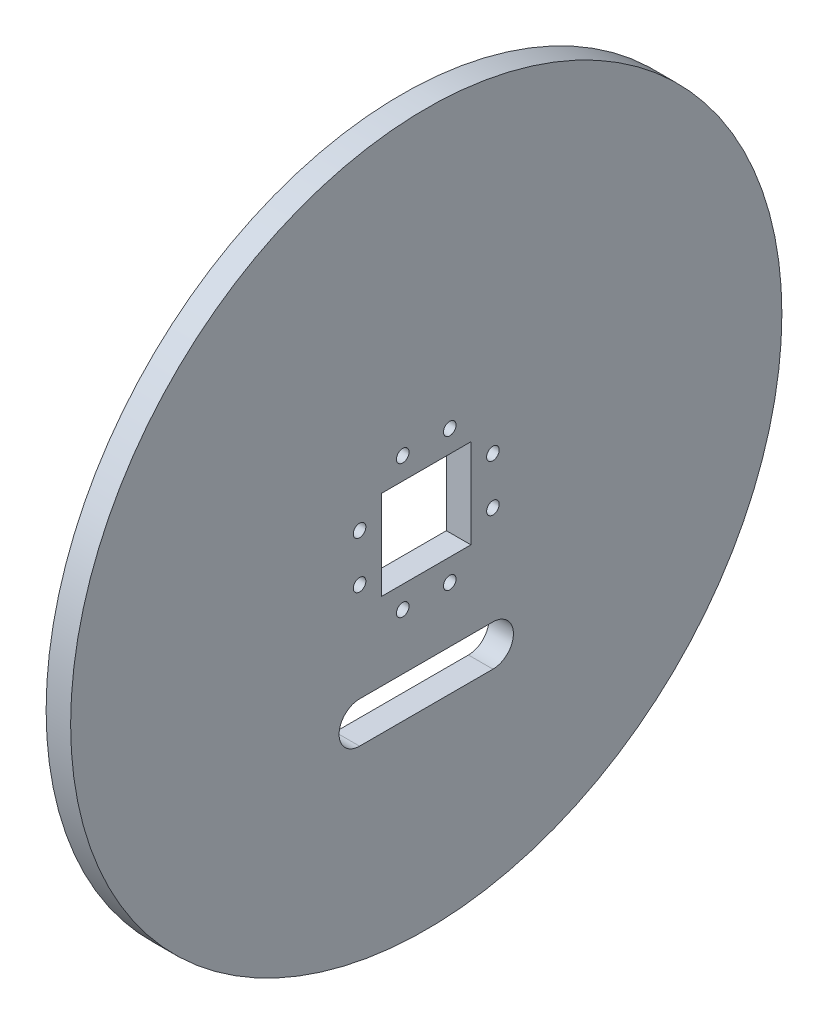
ISO-10303-21;
HEADER;
FILE_DESCRIPTION(('STEP AP214'),'2;1');
FILE_NAME('part.step','',(''),(''),'','','');
FILE_SCHEMA(('AUTOMOTIVE_DESIGN { 1 0 10303 214 1 1 1 1 }'));
ENDSEC;
DATA;
#1=APPLICATION_CONTEXT('core data for automotive mechanical design processes');
#2=APPLICATION_PROTOCOL_DEFINITION('international standard','automotive_design',2000,#1);
#3=PRODUCT_CONTEXT('',#1,'mechanical');
#4=PRODUCT('Part','Part','',(#3));
#5=PRODUCT_RELATED_PRODUCT_CATEGORY('part','',(#4));
#6=PRODUCT_DEFINITION_FORMATION('','',#4);
#7=PRODUCT_DEFINITION_CONTEXT('part definition',#1,'design');
#8=PRODUCT_DEFINITION('design','',#6,#7);
#9=PRODUCT_DEFINITION_SHAPE('','',#8);
#10=(LENGTH_UNIT() NAMED_UNIT(*) SI_UNIT(.MILLI.,.METRE.));
#11=(NAMED_UNIT(*) PLANE_ANGLE_UNIT() SI_UNIT($,.RADIAN.));
#12=(NAMED_UNIT(*) SI_UNIT($,.STERADIAN.) SOLID_ANGLE_UNIT());
#13=UNCERTAINTY_MEASURE_WITH_UNIT(LENGTH_MEASURE(1.E-05),#10,'distance_accuracy_value','');
#14=(GEOMETRIC_REPRESENTATION_CONTEXT(3) GLOBAL_UNCERTAINTY_ASSIGNED_CONTEXT((#13)) GLOBAL_UNIT_ASSIGNED_CONTEXT((#10,
#11,#12)) REPRESENTATION_CONTEXT('',''));
#15=CARTESIAN_POINT('',(0.,0.,0.));
#16=DIRECTION('',(0.,0.,1.));
#17=DIRECTION('',(1.,0.,0.));
#18=AXIS2_PLACEMENT_3D('',#15,#16,#17);
#19=CARTESIAN_POINT('',(7.,0.,0.));
#20=DIRECTION('',(1.,0.,0.));
#21=DIRECTION('',(0.,0.,-1.));
#22=AXIS2_PLACEMENT_3D('',#19,#20,#21);
#23=PLANE('',#22);
#24=CARTESIAN_POINT('',(7.,19.0500000000001,6.71844476050666));
#25=DIRECTION('',(1.,0.,0.));
#26=DIRECTION('',(0.,0.,-1.));
#27=AXIS2_PLACEMENT_3D('',#24,#25,#26);
#28=CIRCLE('',#27,1.8);
#29=CARTESIAN_POINT('',(7.,19.0500000000001,4.91844476050666));
#30=VERTEX_POINT('',#29);
#31=EDGE_CURVE('E232',#30,#30,#28,.T.);
#32=ORIENTED_EDGE('',*,*,#31,.F.);
#33=EDGE_LOOP('',(#32));
#34=FACE_BOUND('',#33,.T.);
#35=CARTESIAN_POINT('',(7.,-6.71844476050673,19.05));
#36=DIRECTION('',(1.,0.,0.));
#37=DIRECTION('',(0.,0.,-1.));
#38=AXIS2_PLACEMENT_3D('',#35,#36,#37);
#39=CIRCLE('',#38,1.8);
#40=CARTESIAN_POINT('',(7.,-6.71844476050673,17.25));
#41=VERTEX_POINT('',#40);
#42=EDGE_CURVE('E240',#41,#41,#39,.T.);
#43=ORIENTED_EDGE('',*,*,#42,.F.);
#44=EDGE_LOOP('',(#43));
#45=FACE_BOUND('',#44,.T.);
#46=CARTESIAN_POINT('',(7.,-19.05,-6.71844476050679));
#47=DIRECTION('',(1.,0.,0.));
#48=DIRECTION('',(0.,0.,-1.));
#49=AXIS2_PLACEMENT_3D('',#46,#47,#48);
#50=CIRCLE('',#49,1.8);
#51=CARTESIAN_POINT('',(7.,-19.05,-8.51844476050679));
#52=VERTEX_POINT('',#51);
#53=EDGE_CURVE('E248',#52,#52,#50,.T.);
#54=ORIENTED_EDGE('',*,*,#53,.F.);
#55=EDGE_LOOP('',(#54));
#56=FACE_BOUND('',#55,.T.);
#57=CARTESIAN_POINT('',(7.,6.71844476050686,-19.05));
#58=DIRECTION('',(1.,0.,0.));
#59=DIRECTION('',(0.,0.,-1.));
#60=AXIS2_PLACEMENT_3D('',#57,#58,#59);
#61=CIRCLE('',#60,1.8);
#62=CARTESIAN_POINT('',(7.,6.71844476050686,-20.85));
#63=VERTEX_POINT('',#62);
#64=EDGE_CURVE('E145',#63,#63,#61,.T.);
#65=ORIENTED_EDGE('',*,*,#64,.F.);
#66=EDGE_LOOP('',(#65));
#67=FACE_BOUND('',#66,.T.);
#68=CARTESIAN_POINT('',(7.,0.,0.));
#69=DIRECTION('',(1.,0.,0.));
#70=DIRECTION('',(0.,0.,-1.));
#71=AXIS2_PLACEMENT_3D('',#68,#69,#70);
#72=CIRCLE('',#71,101.6);
#73=CARTESIAN_POINT('',(7.,0.,-101.6));
#74=VERTEX_POINT('',#73);
#75=EDGE_CURVE('E11',#74,#74,#72,.T.);
#76=ORIENTED_EDGE('',*,*,#75,.T.);
#77=EDGE_LOOP('',(#76));
#78=FACE_BOUND('',#77,.T.);
#79=DIRECTION('',(0.,0.,1.));
#80=VECTOR('',#79,1.);
#81=CARTESIAN_POINT('',(7.,12.75,12.75));
#82=LINE('',#81,#80);
#83=CARTESIAN_POINT('',(7.,12.75,-12.75));
#84=VERTEX_POINT('',#83);
#85=CARTESIAN_POINT('',(7.,12.75,12.75));
#86=VERTEX_POINT('',#85);
#87=EDGE_CURVE('E157',#84,#86,#82,.T.);
#88=ORIENTED_EDGE('',*,*,#87,.F.);
#89=DIRECTION('',(0.,1.,0.));
#90=VECTOR('',#89,1.);
#91=CARTESIAN_POINT('',(7.,-12.75,-12.75));
#92=LINE('',#91,#90);
#93=CARTESIAN_POINT('',(7.,-12.75,-12.75));
#94=VERTEX_POINT('',#93);
#95=EDGE_CURVE('E155',#94,#84,#92,.T.);
#96=ORIENTED_EDGE('',*,*,#95,.F.);
#97=DIRECTION('',(0.,0.,-1.));
#98=VECTOR('',#97,1.);
#99=CARTESIAN_POINT('',(7.,-12.75,12.75));
#100=LINE('',#99,#98);
#101=CARTESIAN_POINT('',(7.,-12.75,12.75));
#102=VERTEX_POINT('',#101);
#103=EDGE_CURVE('E163',#102,#94,#100,.T.);
#104=ORIENTED_EDGE('',*,*,#103,.F.);
#105=DIRECTION('',(0.,-1.,0.));
#106=VECTOR('',#105,1.);
#107=CARTESIAN_POINT('',(7.,-12.75,12.75));
#108=LINE('',#107,#106);
#109=EDGE_CURVE('E160',#86,#102,#108,.T.);
#110=ORIENTED_EDGE('',*,*,#109,.F.);
#111=EDGE_LOOP('',(#88,#96,#104,#110));
#112=FACE_BOUND('',#111,.T.);
#113=DIRECTION('',(0.,0.,-1.));
#114=VECTOR('',#113,1.);
#115=CARTESIAN_POINT('',(7.,-46.6533897491123,19.05));
#116=LINE('',#115,#114);
#117=CARTESIAN_POINT('',(7.,-46.6533897491123,19.05));
#118=VERTEX_POINT('',#117);
#119=CARTESIAN_POINT('',(7.,-46.6533897491123,-19.05));
#120=VERTEX_POINT('',#119);
#121=EDGE_CURVE('E124',#118,#120,#116,.T.);
#122=ORIENTED_EDGE('',*,*,#121,.F.);
#123=CARTESIAN_POINT('',(7.,-40.8076638046452,19.05));
#124=DIRECTION('',(1.,0.,0.));
#125=DIRECTION('',(0.,0.,-1.));
#126=AXIS2_PLACEMENT_3D('',#123,#124,#125);
#127=CIRCLE('',#126,5.84572594446708);
#128=CARTESIAN_POINT('',(7.,-34.9619378601781,19.05));
#129=VERTEX_POINT('',#128);
#130=EDGE_CURVE('E116',#129,#118,#127,.T.);
#131=ORIENTED_EDGE('',*,*,#130,.F.);
#132=DIRECTION('',(0.,0.,1.));
#133=VECTOR('',#132,1.);
#134=CARTESIAN_POINT('',(7.,-34.9619378601781,19.05));
#135=LINE('',#134,#133);
#136=CARTESIAN_POINT('',(7.,-34.9619378601781,-19.05));
#137=VERTEX_POINT('',#136);
#138=EDGE_CURVE('E139',#137,#129,#135,.T.);
#139=ORIENTED_EDGE('',*,*,#138,.F.);
#140=CARTESIAN_POINT('',(7.,-40.8076638046452,-19.05));
#141=DIRECTION('',(1.,0.,0.));
#142=DIRECTION('',(0.,0.,-1.));
#143=AXIS2_PLACEMENT_3D('',#140,#141,#142);
#144=CIRCLE('',#143,5.84572594446708);
#145=EDGE_CURVE('E137',#120,#137,#144,.T.);
#146=ORIENTED_EDGE('',*,*,#145,.F.);
#147=EDGE_LOOP('',(#122,#131,#139,#146));
#148=FACE_BOUND('',#147,.T.);
#149=CARTESIAN_POINT('',(7.,-6.71844476050761,-19.05));
#150=DIRECTION('',(1.,0.,0.));
#151=DIRECTION('',(0.,0.,-1.));
#152=AXIS2_PLACEMENT_3D('',#149,#150,#151);
#153=CIRCLE('',#152,1.8);
#154=CARTESIAN_POINT('',(7.,-6.71844476050761,-20.85));
#155=VERTEX_POINT('',#154);
#156=EDGE_CURVE('E252',#155,#155,#153,.T.);
#157=ORIENTED_EDGE('',*,*,#156,.F.);
#158=EDGE_LOOP('',(#157));
#159=FACE_BOUND('',#158,.T.);
#160=CARTESIAN_POINT('',(7.,-19.05,6.71844476050768));
#161=DIRECTION('',(1.,0.,0.));
#162=DIRECTION('',(0.,0.,-1.));
#163=AXIS2_PLACEMENT_3D('',#160,#161,#162);
#164=CIRCLE('',#163,1.8);
#165=CARTESIAN_POINT('',(7.,-19.05,4.91844476050767));
#166=VERTEX_POINT('',#165);
#167=EDGE_CURVE('E244',#166,#166,#164,.T.);
#168=ORIENTED_EDGE('',*,*,#167,.F.);
#169=EDGE_LOOP('',(#168));
#170=FACE_BOUND('',#169,.T.);
#171=CARTESIAN_POINT('',(7.,6.71844476050774,19.0499999999999));
#172=DIRECTION('',(1.,0.,0.));
#173=DIRECTION('',(0.,0.,-1.));
#174=AXIS2_PLACEMENT_3D('',#171,#172,#173);
#175=CIRCLE('',#174,1.8);
#176=CARTESIAN_POINT('',(7.,6.71844476050774,17.2499999999999));
#177=VERTEX_POINT('',#176);
#178=EDGE_CURVE('E236',#177,#177,#175,.T.);
#179=ORIENTED_EDGE('',*,*,#178,.F.);
#180=EDGE_LOOP('',(#179));
#181=FACE_BOUND('',#180,.T.);
#182=CARTESIAN_POINT('',(7.,19.0499999999999,-6.71844476050781));
#183=DIRECTION('',(1.,0.,0.));
#184=DIRECTION('',(0.,0.,-1.));
#185=AXIS2_PLACEMENT_3D('',#182,#183,#184);
#186=CIRCLE('',#185,1.8);
#187=CARTESIAN_POINT('',(7.,19.0499999999999,-8.51844476050781));
#188=VERTEX_POINT('',#187);
#189=EDGE_CURVE('E227',#188,#188,#186,.T.);
#190=ORIENTED_EDGE('',*,*,#189,.F.);
#191=EDGE_LOOP('',(#190));
#192=FACE_BOUND('',#191,.T.);
#193=ADVANCED_FACE('F50',(#34,#45,#56,#67,#78,#112,#148,#159,#170,#181,#192),#23,.T.);
#194=CARTESIAN_POINT('',(0.,0.,0.));
#195=DIRECTION('',(1.,0.,0.));
#196=DIRECTION('',(0.,0.,-1.));
#197=AXIS2_PLACEMENT_3D('',#194,#195,#196);
#198=PLANE('',#197);
#199=DIRECTION('',(0.,1.,0.));
#200=VECTOR('',#199,1.);
#201=CARTESIAN_POINT('',(0.,-12.75,-12.75));
#202=LINE('',#201,#200);
#203=CARTESIAN_POINT('',(0.,-12.75,-12.75));
#204=VERTEX_POINT('',#203);
#205=CARTESIAN_POINT('',(0.,12.75,-12.75));
#206=VERTEX_POINT('',#205);
#207=EDGE_CURVE('E132',#204,#206,#202,.T.);
#208=ORIENTED_EDGE('',*,*,#207,.T.);
#209=DIRECTION('',(0.,0.,1.));
#210=VECTOR('',#209,1.);
#211=CARTESIAN_POINT('',(0.,12.75,12.75));
#212=LINE('',#211,#210);
#213=CARTESIAN_POINT('',(0.,12.75,12.75));
#214=VERTEX_POINT('',#213);
#215=EDGE_CURVE('E168',#206,#214,#212,.T.);
#216=ORIENTED_EDGE('',*,*,#215,.T.);
#217=DIRECTION('',(0.,-1.,0.));
#218=VECTOR('',#217,1.);
#219=CARTESIAN_POINT('',(0.,-12.75,12.75));
#220=LINE('',#219,#218);
#221=CARTESIAN_POINT('',(0.,-12.75,12.75));
#222=VERTEX_POINT('',#221);
#223=EDGE_CURVE('E171',#214,#222,#220,.T.);
#224=ORIENTED_EDGE('',*,*,#223,.T.);
#225=DIRECTION('',(0.,0.,-1.));
#226=VECTOR('',#225,1.);
#227=CARTESIAN_POINT('',(0.,-12.75,12.75));
#228=LINE('',#227,#226);
#229=EDGE_CURVE('E158',#222,#204,#228,.T.);
#230=ORIENTED_EDGE('',*,*,#229,.T.);
#231=EDGE_LOOP('',(#208,#216,#224,#230));
#232=FACE_BOUND('',#231,.T.);
#233=CARTESIAN_POINT('',(0.,0.,0.));
#234=DIRECTION('',(1.,0.,0.));
#235=DIRECTION('',(0.,0.,-1.));
#236=AXIS2_PLACEMENT_3D('',#233,#234,#235);
#237=CIRCLE('',#236,101.6);
#238=CARTESIAN_POINT('',(0.,0.,-101.6));
#239=VERTEX_POINT('',#238);
#240=EDGE_CURVE('E54',#239,#239,#237,.T.);
#241=ORIENTED_EDGE('',*,*,#240,.F.);
#242=EDGE_LOOP('',(#241));
#243=FACE_BOUND('',#242,.T.);
#244=CARTESIAN_POINT('',(0.,-40.8076638046452,19.05));
#245=DIRECTION('',(1.,0.,0.));
#246=DIRECTION('',(0.,0.,-1.));
#247=AXIS2_PLACEMENT_3D('',#244,#245,#246);
#248=CIRCLE('',#247,5.84572594446708);
#249=CARTESIAN_POINT('',(0.,-34.9619378601781,19.05));
#250=VERTEX_POINT('',#249);
#251=CARTESIAN_POINT('',(0.,-46.6533897491123,19.05));
#252=VERTEX_POINT('',#251);
#253=EDGE_CURVE('E74',#250,#252,#248,.T.);
#254=ORIENTED_EDGE('',*,*,#253,.T.);
#255=DIRECTION('',(0.,0.,-1.));
#256=VECTOR('',#255,1.);
#257=CARTESIAN_POINT('',(0.,-46.6533897491123,19.05));
#258=LINE('',#257,#256);
#259=CARTESIAN_POINT('',(0.,-46.6533897491123,-19.05));
#260=VERTEX_POINT('',#259);
#261=EDGE_CURVE('E131',#252,#260,#258,.T.);
#262=ORIENTED_EDGE('',*,*,#261,.T.);
#263=CARTESIAN_POINT('',(0.,-40.8076638046452,-19.05));
#264=DIRECTION('',(1.,0.,0.));
#265=DIRECTION('',(0.,0.,-1.));
#266=AXIS2_PLACEMENT_3D('',#263,#264,#265);
#267=CIRCLE('',#266,5.84572594446708);
#268=CARTESIAN_POINT('',(0.,-34.9619378601781,-19.05));
#269=VERTEX_POINT('',#268);
#270=EDGE_CURVE('E147',#260,#269,#267,.T.);
#271=ORIENTED_EDGE('',*,*,#270,.T.);
#272=DIRECTION('',(0.,0.,1.));
#273=VECTOR('',#272,1.);
#274=CARTESIAN_POINT('',(0.,-34.9619378601781,19.05));
#275=LINE('',#274,#273);
#276=EDGE_CURVE('E125',#269,#250,#275,.T.);
#277=ORIENTED_EDGE('',*,*,#276,.T.);
#278=EDGE_LOOP('',(#254,#262,#271,#277));
#279=FACE_BOUND('',#278,.T.);
#280=CARTESIAN_POINT('',(0.,6.71844476050686,-19.05));
#281=DIRECTION('',(1.,0.,0.));
#282=DIRECTION('',(0.,0.,-1.));
#283=AXIS2_PLACEMENT_3D('',#280,#281,#282);
#284=CIRCLE('',#283,1.8);
#285=CARTESIAN_POINT('',(0.,6.71844476050686,-20.85));
#286=VERTEX_POINT('',#285);
#287=EDGE_CURVE('E198',#286,#286,#284,.T.);
#288=ORIENTED_EDGE('',*,*,#287,.T.);
#289=EDGE_LOOP('',(#288));
#290=FACE_BOUND('',#289,.T.);
#291=CARTESIAN_POINT('',(0.,-6.71844476050761,-19.05));
#292=DIRECTION('',(1.,0.,0.));
#293=DIRECTION('',(0.,0.,-1.));
#294=AXIS2_PLACEMENT_3D('',#291,#292,#293);
#295=CIRCLE('',#294,1.8);
#296=CARTESIAN_POINT('',(0.,-6.71844476050761,-20.85));
#297=VERTEX_POINT('',#296);
#298=EDGE_CURVE('E202',#297,#297,#295,.T.);
#299=ORIENTED_EDGE('',*,*,#298,.T.);
#300=EDGE_LOOP('',(#299));
#301=FACE_BOUND('',#300,.T.);
#302=CARTESIAN_POINT('',(0.,-19.05,-6.71844476050679));
#303=DIRECTION('',(1.,0.,0.));
#304=DIRECTION('',(0.,0.,-1.));
#305=AXIS2_PLACEMENT_3D('',#302,#303,#304);
#306=CIRCLE('',#305,1.8);
#307=CARTESIAN_POINT('',(0.,-19.05,-8.51844476050679));
#308=VERTEX_POINT('',#307);
#309=EDGE_CURVE('E206',#308,#308,#306,.T.);
#310=ORIENTED_EDGE('',*,*,#309,.T.);
#311=EDGE_LOOP('',(#310));
#312=FACE_BOUND('',#311,.T.);
#313=CARTESIAN_POINT('',(0.,-19.05,6.71844476050768));
#314=DIRECTION('',(1.,0.,0.));
#315=DIRECTION('',(0.,0.,-1.));
#316=AXIS2_PLACEMENT_3D('',#313,#314,#315);
#317=CIRCLE('',#316,1.8);
#318=CARTESIAN_POINT('',(0.,-19.05,4.91844476050767));
#319=VERTEX_POINT('',#318);
#320=EDGE_CURVE('E210',#319,#319,#317,.T.);
#321=ORIENTED_EDGE('',*,*,#320,.T.);
#322=EDGE_LOOP('',(#321));
#323=FACE_BOUND('',#322,.T.);
#324=CARTESIAN_POINT('',(0.,-6.71844476050673,19.05));
#325=DIRECTION('',(1.,0.,0.));
#326=DIRECTION('',(0.,0.,-1.));
#327=AXIS2_PLACEMENT_3D('',#324,#325,#326);
#328=CIRCLE('',#327,1.8);
#329=CARTESIAN_POINT('',(0.,-6.71844476050673,17.25));
#330=VERTEX_POINT('',#329);
#331=EDGE_CURVE('E214',#330,#330,#328,.T.);
#332=ORIENTED_EDGE('',*,*,#331,.T.);
#333=EDGE_LOOP('',(#332));
#334=FACE_BOUND('',#333,.T.);
#335=CARTESIAN_POINT('',(0.,6.71844476050774,19.0499999999999));
#336=DIRECTION('',(1.,0.,0.));
#337=DIRECTION('',(0.,0.,-1.));
#338=AXIS2_PLACEMENT_3D('',#335,#336,#337);
#339=CIRCLE('',#338,1.8);
#340=CARTESIAN_POINT('',(0.,6.71844476050774,17.2499999999999));
#341=VERTEX_POINT('',#340);
#342=EDGE_CURVE('E218',#341,#341,#339,.T.);
#343=ORIENTED_EDGE('',*,*,#342,.T.);
#344=EDGE_LOOP('',(#343));
#345=FACE_BOUND('',#344,.T.);
#346=CARTESIAN_POINT('',(0.,19.0500000000001,6.71844476050666));
#347=DIRECTION('',(1.,0.,0.));
#348=DIRECTION('',(0.,0.,-1.));
#349=AXIS2_PLACEMENT_3D('',#346,#347,#348);
#350=CIRCLE('',#349,1.8);
#351=CARTESIAN_POINT('',(0.,19.0500000000001,4.91844476050666));
#352=VERTEX_POINT('',#351);
#353=EDGE_CURVE('E222',#352,#352,#350,.T.);
#354=ORIENTED_EDGE('',*,*,#353,.T.);
#355=EDGE_LOOP('',(#354));
#356=FACE_BOUND('',#355,.T.);
#357=CARTESIAN_POINT('',(0.,19.0499999999999,-6.71844476050781));
#358=DIRECTION('',(1.,0.,0.));
#359=DIRECTION('',(0.,0.,-1.));
#360=AXIS2_PLACEMENT_3D('',#357,#358,#359);
#361=CIRCLE('',#360,1.8);
#362=CARTESIAN_POINT('',(0.,19.0499999999999,-8.51844476050781));
#363=VERTEX_POINT('',#362);
#364=EDGE_CURVE('E225',#363,#363,#361,.T.);
#365=ORIENTED_EDGE('',*,*,#364,.T.);
#366=EDGE_LOOP('',(#365));
#367=FACE_BOUND('',#366,.T.);
#368=ADVANCED_FACE('F190',(#232,#243,#279,#290,#301,#312,#323,#334,#345,#356,#367),#198,.F.);
#369=CARTESIAN_POINT('',(7.,0.,0.));
#370=DIRECTION('',(-1.,0.,0.));
#371=DIRECTION('',(0.,0.,1.));
#372=AXIS2_PLACEMENT_3D('',#369,#370,#371);
#373=CYLINDRICAL_SURFACE('',#372,101.6);
#374=ORIENTED_EDGE('',*,*,#75,.F.);
#375=EDGE_LOOP('',(#374));
#376=FACE_BOUND('',#375,.T.);
#377=ORIENTED_EDGE('',*,*,#240,.T.);
#378=EDGE_LOOP('',(#377));
#379=FACE_BOUND('',#378,.T.);
#380=ADVANCED_FACE('F52',(#376,#379),#373,.T.);
#381=CARTESIAN_POINT('',(7.,-12.75,-12.75));
#382=DIRECTION('',(0.,0.,1.));
#383=DIRECTION('',(1.,0.,0.));
#384=AXIS2_PLACEMENT_3D('',#381,#382,#383);
#385=PLANE('',#384);
#386=ORIENTED_EDGE('',*,*,#207,.F.);
#387=DIRECTION('',(-1.,0.,0.));
#388=VECTOR('',#387,1.);
#389=CARTESIAN_POINT('',(7.,-12.75,-12.75));
#390=LINE('',#389,#388);
#391=EDGE_CURVE('E165',#94,#204,#390,.T.);
#392=ORIENTED_EDGE('',*,*,#391,.F.);
#393=ORIENTED_EDGE('',*,*,#95,.T.);
#394=DIRECTION('',(-1.,0.,0.));
#395=VECTOR('',#394,1.);
#396=CARTESIAN_POINT('',(7.,12.75,-12.75));
#397=LINE('',#396,#395);
#398=EDGE_CURVE('E182',#84,#206,#397,.T.);
#399=ORIENTED_EDGE('',*,*,#398,.T.);
#400=EDGE_LOOP('',(#386,#392,#393,#399));
#401=FACE_BOUND('',#400,.T.);
#402=ADVANCED_FACE('F280',(#401),#385,.T.);
#403=CARTESIAN_POINT('',(7.,12.75,12.75));
#404=DIRECTION('',(0.,-1.,0.));
#405=DIRECTION('',(0.,0.,-1.));
#406=AXIS2_PLACEMENT_3D('',#403,#404,#405);
#407=PLANE('',#406);
#408=ORIENTED_EDGE('',*,*,#215,.F.);
#409=ORIENTED_EDGE('',*,*,#398,.F.);
#410=ORIENTED_EDGE('',*,*,#87,.T.);
#411=DIRECTION('',(-1.,0.,0.));
#412=VECTOR('',#411,1.);
#413=CARTESIAN_POINT('',(7.,12.75,12.75));
#414=LINE('',#413,#412);
#415=EDGE_CURVE('E180',#86,#214,#414,.T.);
#416=ORIENTED_EDGE('',*,*,#415,.T.);
#417=EDGE_LOOP('',(#408,#409,#410,#416));
#418=FACE_BOUND('',#417,.T.);
#419=ADVANCED_FACE('F274',(#418),#407,.T.);
#420=CARTESIAN_POINT('',(7.,-12.75,12.75));
#421=DIRECTION('',(0.,0.,-1.));
#422=DIRECTION('',(-1.,0.,0.));
#423=AXIS2_PLACEMENT_3D('',#420,#421,#422);
#424=PLANE('',#423);
#425=ORIENTED_EDGE('',*,*,#223,.F.);
#426=ORIENTED_EDGE('',*,*,#415,.F.);
#427=ORIENTED_EDGE('',*,*,#109,.T.);
#428=DIRECTION('',(-1.,0.,0.));
#429=VECTOR('',#428,1.);
#430=CARTESIAN_POINT('',(7.,-12.75,12.75));
#431=LINE('',#430,#429);
#432=EDGE_CURVE('E178',#102,#222,#431,.T.);
#433=ORIENTED_EDGE('',*,*,#432,.T.);
#434=EDGE_LOOP('',(#425,#426,#427,#433));
#435=FACE_BOUND('',#434,.T.);
#436=ADVANCED_FACE('F277',(#435),#424,.T.);
#437=CARTESIAN_POINT('',(7.,-12.75,12.75));
#438=DIRECTION('',(0.,1.,0.));
#439=DIRECTION('',(0.,0.,1.));
#440=AXIS2_PLACEMENT_3D('',#437,#438,#439);
#441=PLANE('',#440);
#442=ORIENTED_EDGE('',*,*,#229,.F.);
#443=ORIENTED_EDGE('',*,*,#432,.F.);
#444=ORIENTED_EDGE('',*,*,#103,.T.);
#445=ORIENTED_EDGE('',*,*,#391,.T.);
#446=EDGE_LOOP('',(#442,#443,#444,#445));
#447=FACE_BOUND('',#446,.T.);
#448=ADVANCED_FACE('F282',(#447),#441,.T.);
#449=CARTESIAN_POINT('',(7.,-40.8076638046452,19.05));
#450=DIRECTION('',(-1.,0.,0.));
#451=DIRECTION('',(0.,0.,1.));
#452=AXIS2_PLACEMENT_3D('',#449,#450,#451);
#453=CYLINDRICAL_SURFACE('',#452,5.84572594446708);
#454=ORIENTED_EDGE('',*,*,#253,.F.);
#455=DIRECTION('',(-1.,0.,0.));
#456=VECTOR('',#455,1.);
#457=CARTESIAN_POINT('',(7.,-34.9619378601781,19.05));
#458=LINE('',#457,#456);
#459=EDGE_CURVE('E120',#129,#250,#458,.T.);
#460=ORIENTED_EDGE('',*,*,#459,.F.);
#461=ORIENTED_EDGE('',*,*,#130,.T.);
#462=DIRECTION('',(-1.,0.,0.));
#463=VECTOR('',#462,1.);
#464=CARTESIAN_POINT('',(7.,-46.6533897491123,19.05));
#465=LINE('',#464,#463);
#466=EDGE_CURVE('E119',#118,#252,#465,.T.);
#467=ORIENTED_EDGE('',*,*,#466,.T.);
#468=EDGE_LOOP('',(#454,#460,#461,#467));
#469=FACE_BOUND('',#468,.T.);
#470=ADVANCED_FACE('F118',(#469),#453,.F.);
#471=CARTESIAN_POINT('',(7.,-46.6533897491123,19.05));
#472=DIRECTION('',(0.,1.,0.));
#473=DIRECTION('',(0.,0.,1.));
#474=AXIS2_PLACEMENT_3D('',#471,#472,#473);
#475=PLANE('',#474);
#476=ORIENTED_EDGE('',*,*,#261,.F.);
#477=ORIENTED_EDGE('',*,*,#466,.F.);
#478=ORIENTED_EDGE('',*,*,#121,.T.);
#479=DIRECTION('',(-1.,0.,0.));
#480=VECTOR('',#479,1.);
#481=CARTESIAN_POINT('',(7.,-46.6533897491123,-19.05));
#482=LINE('',#481,#480);
#483=EDGE_CURVE('E133',#120,#260,#482,.T.);
#484=ORIENTED_EDGE('',*,*,#483,.T.);
#485=EDGE_LOOP('',(#476,#477,#478,#484));
#486=FACE_BOUND('',#485,.T.);
#487=ADVANCED_FACE('F128',(#486),#475,.T.);
#488=CARTESIAN_POINT('',(7.,-40.8076638046452,-19.05));
#489=DIRECTION('',(-1.,0.,0.));
#490=DIRECTION('',(0.,0.,1.));
#491=AXIS2_PLACEMENT_3D('',#488,#489,#490);
#492=CYLINDRICAL_SURFACE('',#491,5.84572594446708);
#493=ORIENTED_EDGE('',*,*,#270,.F.);
#494=ORIENTED_EDGE('',*,*,#483,.F.);
#495=ORIENTED_EDGE('',*,*,#145,.T.);
#496=DIRECTION('',(-1.,0.,0.));
#497=VECTOR('',#496,1.);
#498=CARTESIAN_POINT('',(7.,-34.9619378601781,-19.05));
#499=LINE('',#498,#497);
#500=EDGE_CURVE('E66',#137,#269,#499,.T.);
#501=ORIENTED_EDGE('',*,*,#500,.T.);
#502=EDGE_LOOP('',(#493,#494,#495,#501));
#503=FACE_BOUND('',#502,.T.);
#504=ADVANCED_FACE('F360',(#503),#492,.F.);
#505=CARTESIAN_POINT('',(7.,-34.9619378601781,19.05));
#506=DIRECTION('',(0.,-1.,0.));
#507=DIRECTION('',(0.,0.,-1.));
#508=AXIS2_PLACEMENT_3D('',#505,#506,#507);
#509=PLANE('',#508);
#510=ORIENTED_EDGE('',*,*,#276,.F.);
#511=ORIENTED_EDGE('',*,*,#500,.F.);
#512=ORIENTED_EDGE('',*,*,#138,.T.);
#513=ORIENTED_EDGE('',*,*,#459,.T.);
#514=EDGE_LOOP('',(#510,#511,#512,#513));
#515=FACE_BOUND('',#514,.T.);
#516=ADVANCED_FACE('F369',(#515),#509,.T.);
#517=CARTESIAN_POINT('',(7.,6.71844476050686,-19.05));
#518=DIRECTION('',(-1.,0.,0.));
#519=DIRECTION('',(0.,0.,1.));
#520=AXIS2_PLACEMENT_3D('',#517,#518,#519);
#521=CYLINDRICAL_SURFACE('',#520,1.8);
#522=ORIENTED_EDGE('',*,*,#64,.T.);
#523=EDGE_LOOP('',(#522));
#524=FACE_BOUND('',#523,.T.);
#525=ORIENTED_EDGE('',*,*,#287,.F.);
#526=EDGE_LOOP('',(#525));
#527=FACE_BOUND('',#526,.T.);
#528=ADVANCED_FACE('F259',(#524,#527),#521,.F.);
#529=CARTESIAN_POINT('',(7.,-6.71844476050761,-19.05));
#530=DIRECTION('',(-1.,0.,0.));
#531=DIRECTION('',(0.,0.,1.));
#532=AXIS2_PLACEMENT_3D('',#529,#530,#531);
#533=CYLINDRICAL_SURFACE('',#532,1.8);
#534=ORIENTED_EDGE('',*,*,#156,.T.);
#535=EDGE_LOOP('',(#534));
#536=FACE_BOUND('',#535,.T.);
#537=ORIENTED_EDGE('',*,*,#298,.F.);
#538=EDGE_LOOP('',(#537));
#539=FACE_BOUND('',#538,.T.);
#540=ADVANCED_FACE('F389',(#536,#539),#533,.F.);
#541=CARTESIAN_POINT('',(7.,-19.05,-6.71844476050679));
#542=DIRECTION('',(-1.,0.,0.));
#543=DIRECTION('',(0.,0.,1.));
#544=AXIS2_PLACEMENT_3D('',#541,#542,#543);
#545=CYLINDRICAL_SURFACE('',#544,1.8);
#546=ORIENTED_EDGE('',*,*,#53,.T.);
#547=EDGE_LOOP('',(#546));
#548=FACE_BOUND('',#547,.T.);
#549=ORIENTED_EDGE('',*,*,#309,.F.);
#550=EDGE_LOOP('',(#549));
#551=FACE_BOUND('',#550,.T.);
#552=ADVANCED_FACE('F399',(#548,#551),#545,.F.);
#553=CARTESIAN_POINT('',(7.,-19.05,6.71844476050768));
#554=DIRECTION('',(-1.,0.,0.));
#555=DIRECTION('',(0.,0.,1.));
#556=AXIS2_PLACEMENT_3D('',#553,#554,#555);
#557=CYLINDRICAL_SURFACE('',#556,1.8);
#558=ORIENTED_EDGE('',*,*,#167,.T.);
#559=EDGE_LOOP('',(#558));
#560=FACE_BOUND('',#559,.T.);
#561=ORIENTED_EDGE('',*,*,#320,.F.);
#562=EDGE_LOOP('',(#561));
#563=FACE_BOUND('',#562,.T.);
#564=ADVANCED_FACE('F410',(#560,#563),#557,.F.);
#565=CARTESIAN_POINT('',(7.,-6.71844476050673,19.05));
#566=DIRECTION('',(-1.,0.,0.));
#567=DIRECTION('',(0.,0.,1.));
#568=AXIS2_PLACEMENT_3D('',#565,#566,#567);
#569=CYLINDRICAL_SURFACE('',#568,1.8);
#570=ORIENTED_EDGE('',*,*,#42,.T.);
#571=EDGE_LOOP('',(#570));
#572=FACE_BOUND('',#571,.T.);
#573=ORIENTED_EDGE('',*,*,#331,.F.);
#574=EDGE_LOOP('',(#573));
#575=FACE_BOUND('',#574,.T.);
#576=ADVANCED_FACE('F421',(#572,#575),#569,.F.);
#577=CARTESIAN_POINT('',(7.,6.71844476050774,19.0499999999999));
#578=DIRECTION('',(-1.,0.,0.));
#579=DIRECTION('',(0.,0.,1.));
#580=AXIS2_PLACEMENT_3D('',#577,#578,#579);
#581=CYLINDRICAL_SURFACE('',#580,1.8);
#582=ORIENTED_EDGE('',*,*,#178,.T.);
#583=EDGE_LOOP('',(#582));
#584=FACE_BOUND('',#583,.T.);
#585=ORIENTED_EDGE('',*,*,#342,.F.);
#586=EDGE_LOOP('',(#585));
#587=FACE_BOUND('',#586,.T.);
#588=ADVANCED_FACE('F432',(#584,#587),#581,.F.);
#589=CARTESIAN_POINT('',(7.,19.0500000000001,6.71844476050666));
#590=DIRECTION('',(-1.,0.,0.));
#591=DIRECTION('',(0.,0.,1.));
#592=AXIS2_PLACEMENT_3D('',#589,#590,#591);
#593=CYLINDRICAL_SURFACE('',#592,1.8);
#594=ORIENTED_EDGE('',*,*,#31,.T.);
#595=EDGE_LOOP('',(#594));
#596=FACE_BOUND('',#595,.T.);
#597=ORIENTED_EDGE('',*,*,#353,.F.);
#598=EDGE_LOOP('',(#597));
#599=FACE_BOUND('',#598,.T.);
#600=ADVANCED_FACE('F443',(#596,#599),#593,.F.);
#601=CARTESIAN_POINT('',(7.,19.0499999999999,-6.71844476050781));
#602=DIRECTION('',(-1.,0.,0.));
#603=DIRECTION('',(0.,0.,1.));
#604=AXIS2_PLACEMENT_3D('',#601,#602,#603);
#605=CYLINDRICAL_SURFACE('',#604,1.8);
#606=ORIENTED_EDGE('',*,*,#189,.T.);
#607=EDGE_LOOP('',(#606));
#608=FACE_BOUND('',#607,.T.);
#609=ORIENTED_EDGE('',*,*,#364,.F.);
#610=EDGE_LOOP('',(#609));
#611=FACE_BOUND('',#610,.T.);
#612=ADVANCED_FACE('F454',(#608,#611),#605,.F.);
#613=CLOSED_SHELL('',(#193,#368,#380,#402,#419,#436,#448,#470,#487,#504,#516,#528,#540,#552,
#564,#576,#588,#600,#612));
#614=MANIFOLD_SOLID_BREP('B2',#613);
#615=ADVANCED_BREP_SHAPE_REPRESENTATION('',(#18,#614),#14);
#616=SHAPE_DEFINITION_REPRESENTATION(#9,#615);
ENDSEC;
END-ISO-10303-21;
